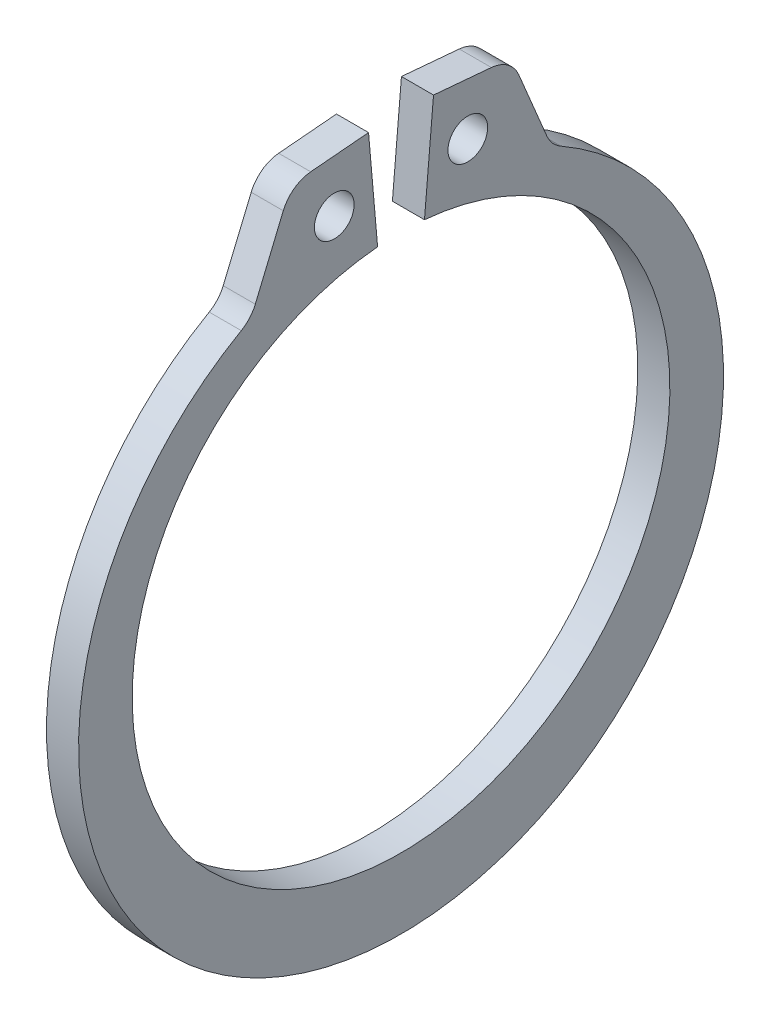
ISO-10303-21;
HEADER;
FILE_DESCRIPTION(('STEP AP214'),'2;1');
FILE_NAME('part.step','',(''),(''),'','','');
FILE_SCHEMA(('AUTOMOTIVE_DESIGN { 1 0 10303 214 1 1 1 1 }'));
ENDSEC;
DATA;
#1=APPLICATION_CONTEXT('core data for automotive mechanical design processes');
#2=APPLICATION_PROTOCOL_DEFINITION('international standard','automotive_design',2000,#1);
#3=PRODUCT_CONTEXT('',#1,'mechanical');
#4=PRODUCT('Part','Part','',(#3));
#5=PRODUCT_RELATED_PRODUCT_CATEGORY('part','',(#4));
#6=PRODUCT_DEFINITION_FORMATION('','',#4);
#7=PRODUCT_DEFINITION_CONTEXT('part definition',#1,'design');
#8=PRODUCT_DEFINITION('design','',#6,#7);
#9=PRODUCT_DEFINITION_SHAPE('','',#8);
#10=(LENGTH_UNIT() NAMED_UNIT(*) SI_UNIT(.MILLI.,.METRE.));
#11=(NAMED_UNIT(*) PLANE_ANGLE_UNIT() SI_UNIT($,.RADIAN.));
#12=(NAMED_UNIT(*) SI_UNIT($,.STERADIAN.) SOLID_ANGLE_UNIT());
#13=UNCERTAINTY_MEASURE_WITH_UNIT(LENGTH_MEASURE(1.E-05),#10,'distance_accuracy_value','');
#14=(GEOMETRIC_REPRESENTATION_CONTEXT(3) GLOBAL_UNCERTAINTY_ASSIGNED_CONTEXT((#13)) GLOBAL_UNIT_ASSIGNED_CONTEXT((#10,
#11,#12)) REPRESENTATION_CONTEXT('',''));
#15=CARTESIAN_POINT('',(0.,0.,0.));
#16=DIRECTION('',(0.,0.,1.));
#17=DIRECTION('',(1.,0.,0.));
#18=AXIS2_PLACEMENT_3D('',#15,#16,#17);
#19=CARTESIAN_POINT('',(0.5334,0.,0.));
#20=DIRECTION('',(1.,0.,0.));
#21=DIRECTION('',(0.,0.,-1.));
#22=AXIS2_PLACEMENT_3D('',#19,#20,#21);
#23=PLANE('',#22);
#24=CARTESIAN_POINT('',(0.5334,10.5145034900874,2.22024807554007));
#25=DIRECTION('',(1.,0.,0.));
#26=DIRECTION('',(0.,0.,-1.));
#27=AXIS2_PLACEMENT_3D('',#24,#25,#26);
#28=CIRCLE('',#27,0.6604);
#29=CARTESIAN_POINT('',(0.5334,10.5145034900874,1.55984807554007));
#30=VERTEX_POINT('',#29);
#31=EDGE_CURVE('E221',#30,#30,#28,.T.);
#32=ORIENTED_EDGE('',*,*,#31,.F.);
#33=EDGE_LOOP('',(#32));
#34=FACE_BOUND('',#33,.T.);
#35=DIRECTION('',(0.,-0.087155742747658,0.996194698091746));
#36=VECTOR('',#35,1.);
#37=CARTESIAN_POINT('',(0.5334,12.3480325217868,1.08031286250578));
#38=LINE('',#37,#36);
#39=CARTESIAN_POINT('',(0.5334,12.3480325217868,1.08031286250578));
#40=VERTEX_POINT('',#39);
#41=CARTESIAN_POINT('',(0.5334,12.1797719716871,3.0035397506368));
#42=VERTEX_POINT('',#41);
#43=EDGE_CURVE('E133',#40,#42,#38,.T.);
#44=ORIENTED_EDGE('',*,*,#43,.T.);
#45=CARTESIAN_POINT('',(0.5334,11.0917281224313,2.9083482484078));
#46=DIRECTION('',(1.,0.,0.));
#47=DIRECTION('',(0.,0.,-1.));
#48=AXIS2_PLACEMENT_3D('',#45,#46,#47);
#49=CIRCLE('',#48,1.0922);
#50=CARTESIAN_POINT('',(0.5334,11.5131216109069,3.9159832854477));
#51=VERTEX_POINT('',#50);
#52=EDGE_CURVE('E174',#42,#51,#49,.T.);
#53=ORIENTED_EDGE('',*,*,#52,.T.);
#54=DIRECTION('',(0.,-0.922573738362845,0.385820809810985));
#55=VECTOR('',#54,1.);
#56=CARTESIAN_POINT('',(0.5334,12.1222294234762,3.66125408632187));
#57=LINE('',#56,#55);
#58=CARTESIAN_POINT('',(0.5334,9.28769615286388,4.8466573515877));
#59=VERTEX_POINT('',#58);
#60=EDGE_CURVE('E213',#51,#59,#57,.T.);
#61=ORIENTED_EDGE('',*,*,#60,.T.);
#62=CARTESIAN_POINT('',(0.5334,9.70908964133944,5.8542923886276));
#63=DIRECTION('',(1.,0.,0.));
#64=DIRECTION('',(0.,0.,-1.));
#65=AXIS2_PLACEMENT_3D('',#62,#63,#64);
#66=CIRCLE('',#65,1.0922);
#67=CARTESIAN_POINT('',(0.5334,8.76037858528973,5.31313790779144));
#68=VERTEX_POINT('',#67);
#69=EDGE_CURVE('E181',#59,#68,#66,.F.);
#70=ORIENTED_EDGE('',*,*,#69,.T.);
#71=CARTESIAN_POINT('',(0.5334,-0.554212449141249,0.));
#72=DIRECTION('',(1.,0.,0.));
#73=DIRECTION('',(0.,0.,-1.));
#74=AXIS2_PLACEMENT_3D('',#71,#72,#73);
#75=CIRCLE('',#74,10.7233875508587);
#76=CARTESIAN_POINT('',(0.5334,8.76037858528973,-5.31313790779144));
#77=VERTEX_POINT('',#76);
#78=EDGE_CURVE('E206',#68,#77,#75,.T.);
#79=ORIENTED_EDGE('',*,*,#78,.T.);
#80=CARTESIAN_POINT('',(0.5334,9.70908964133944,-5.8542923886276));
#81=DIRECTION('',(1.,0.,0.));
#82=DIRECTION('',(0.,0.,-1.));
#83=AXIS2_PLACEMENT_3D('',#80,#81,#82);
#84=CIRCLE('',#83,1.0922);
#85=CARTESIAN_POINT('',(0.5334,9.28769615286388,-4.8466573515877));
#86=VERTEX_POINT('',#85);
#87=EDGE_CURVE('E11',#77,#86,#84,.F.);
#88=ORIENTED_EDGE('',*,*,#87,.T.);
#89=DIRECTION('',(0.,0.922573738362845,0.385820809810985));
#90=VECTOR('',#89,1.);
#91=CARTESIAN_POINT('',(0.5334,12.1222294234762,-3.66125408632187));
#92=LINE('',#91,#90);
#93=CARTESIAN_POINT('',(0.5334,11.5131216109069,-3.9159832854477));
#94=VERTEX_POINT('',#93);
#95=EDGE_CURVE('E205',#86,#94,#92,.T.);
#96=ORIENTED_EDGE('',*,*,#95,.T.);
#97=CARTESIAN_POINT('',(0.5334,11.0917281224313,-2.9083482484078));
#98=DIRECTION('',(1.,0.,0.));
#99=DIRECTION('',(0.,0.,-1.));
#100=AXIS2_PLACEMENT_3D('',#97,#98,#99);
#101=CIRCLE('',#100,1.0922);
#102=CARTESIAN_POINT('',(0.5334,12.1797719716871,-3.0035397506368));
#103=VERTEX_POINT('',#102);
#104=EDGE_CURVE('E49',#94,#103,#101,.T.);
#105=ORIENTED_EDGE('',*,*,#104,.T.);
#106=DIRECTION('',(0.,0.087155742747658,0.996194698091746));
#107=VECTOR('',#106,1.);
#108=CARTESIAN_POINT('',(0.5334,12.3480325217868,-1.08031286250578));
#109=LINE('',#108,#107);
#110=CARTESIAN_POINT('',(0.5334,12.3480325217868,-1.08031286250578));
#111=VERTEX_POINT('',#110);
#112=EDGE_CURVE('E210',#103,#111,#109,.T.);
#113=ORIENTED_EDGE('',*,*,#112,.T.);
#114=DIRECTION('',(0.,-0.996194698091746,0.0871557427476585));
#115=VECTOR('',#114,1.);
#116=CARTESIAN_POINT('',(0.5334,8.90677755669868,-0.779242064758265));
#117=LINE('',#116,#115);
#118=CARTESIAN_POINT('',(0.5334,8.90677755669868,-0.779242064758265));
#119=VERTEX_POINT('',#118);
#120=EDGE_CURVE('E139',#111,#119,#117,.T.);
#121=ORIENTED_EDGE('',*,*,#120,.T.);
#122=CARTESIAN_POINT('',(0.5334,0.,0.));
#123=DIRECTION('',(-1.,0.,0.));
#124=DIRECTION('',(0.,0.,-1.));
#125=AXIS2_PLACEMENT_3D('',#122,#123,#124);
#126=CIRCLE('',#125,8.9408);
#127=CARTESIAN_POINT('',(0.5334,8.90677755669868,0.779242064758265));
#128=VERTEX_POINT('',#127);
#129=EDGE_CURVE('E134',#119,#128,#126,.T.);
#130=ORIENTED_EDGE('',*,*,#129,.T.);
#131=DIRECTION('',(0.,0.996194698091746,0.0871557427476585));
#132=VECTOR('',#131,1.);
#133=CARTESIAN_POINT('',(0.5334,8.90677755669868,0.779242064758265));
#134=LINE('',#133,#132);
#135=EDGE_CURVE('E125',#128,#40,#134,.T.);
#136=ORIENTED_EDGE('',*,*,#135,.T.);
#137=EDGE_LOOP('',(#44,#53,#61,#70,#79,#88,#96,#105,#113,#121,#130,#136));
#138=FACE_BOUND('',#137,.T.);
#139=CARTESIAN_POINT('',(0.5334,10.5145034900874,-2.22024807554007));
#140=DIRECTION('',(1.,0.,0.));
#141=DIRECTION('',(0.,0.,-1.));
#142=AXIS2_PLACEMENT_3D('',#139,#140,#141);
#143=CIRCLE('',#142,0.6604);
#144=CARTESIAN_POINT('',(0.5334,10.5145034900874,-2.88064807554007));
#145=VERTEX_POINT('',#144);
#146=EDGE_CURVE('E247',#145,#145,#143,.T.);
#147=ORIENTED_EDGE('',*,*,#146,.F.);
#148=EDGE_LOOP('',(#147));
#149=FACE_BOUND('',#148,.T.);
#150=ADVANCED_FACE('F34',(#34,#138,#149),#23,.T.);
#151=CARTESIAN_POINT('',(-0.5334,0.,0.));
#152=DIRECTION('',(1.,0.,0.));
#153=DIRECTION('',(0.,0.,-1.));
#154=AXIS2_PLACEMENT_3D('',#151,#152,#153);
#155=PLANE('',#154);
#156=DIRECTION('',(0.,-0.922573738362845,0.385820809810985));
#157=VECTOR('',#156,1.);
#158=CARTESIAN_POINT('',(-0.5334,12.1222294234762,3.66125408632187));
#159=LINE('',#158,#157);
#160=CARTESIAN_POINT('',(-0.5334,11.5131216109069,3.9159832854477));
#161=VERTEX_POINT('',#160);
#162=CARTESIAN_POINT('',(-0.5334,9.28769615286388,4.8466573515877));
#163=VERTEX_POINT('',#162);
#164=EDGE_CURVE('E200',#161,#163,#159,.T.);
#165=ORIENTED_EDGE('',*,*,#164,.F.);
#166=CARTESIAN_POINT('',(-0.5334,11.0917281224313,2.9083482484078));
#167=DIRECTION('',(1.,0.,0.));
#168=DIRECTION('',(0.,0.,-1.));
#169=AXIS2_PLACEMENT_3D('',#166,#167,#168);
#170=CIRCLE('',#169,1.0922);
#171=CARTESIAN_POINT('',(-0.5334,12.1797719716871,3.0035397506368));
#172=VERTEX_POINT('',#171);
#173=EDGE_CURVE('E170',#161,#172,#170,.F.);
#174=ORIENTED_EDGE('',*,*,#173,.T.);
#175=DIRECTION('',(0.,-0.087155742747658,0.996194698091746));
#176=VECTOR('',#175,1.);
#177=CARTESIAN_POINT('',(-0.5334,12.3480325217868,1.08031286250578));
#178=LINE('',#177,#176);
#179=CARTESIAN_POINT('',(-0.5334,12.3480325217868,1.08031286250578));
#180=VERTEX_POINT('',#179);
#181=EDGE_CURVE('E223',#180,#172,#178,.T.);
#182=ORIENTED_EDGE('',*,*,#181,.F.);
#183=DIRECTION('',(0.,0.996194698091746,0.0871557427476585));
#184=VECTOR('',#183,1.);
#185=CARTESIAN_POINT('',(-0.5334,8.90677755669868,0.779242064758265));
#186=LINE('',#185,#184);
#187=CARTESIAN_POINT('',(-0.5334,8.90677755669868,0.779242064758265));
#188=VERTEX_POINT('',#187);
#189=EDGE_CURVE('E220',#188,#180,#186,.T.);
#190=ORIENTED_EDGE('',*,*,#189,.F.);
#191=CARTESIAN_POINT('',(-0.5334,0.,0.));
#192=DIRECTION('',(-1.,0.,0.));
#193=DIRECTION('',(0.,0.,-1.));
#194=AXIS2_PLACEMENT_3D('',#191,#192,#193);
#195=CIRCLE('',#194,8.9408);
#196=CARTESIAN_POINT('',(-0.5334,8.90677755669868,-0.779242064758265));
#197=VERTEX_POINT('',#196);
#198=EDGE_CURVE('E147',#197,#188,#195,.T.);
#199=ORIENTED_EDGE('',*,*,#198,.F.);
#200=DIRECTION('',(0.,-0.996194698091746,0.0871557427476585));
#201=VECTOR('',#200,1.);
#202=CARTESIAN_POINT('',(-0.5334,8.90677755669868,-0.779242064758265));
#203=LINE('',#202,#201);
#204=CARTESIAN_POINT('',(-0.5334,12.3480325217868,-1.08031286250578));
#205=VERTEX_POINT('',#204);
#206=EDGE_CURVE('E143',#205,#197,#203,.T.);
#207=ORIENTED_EDGE('',*,*,#206,.F.);
#208=DIRECTION('',(0.,0.087155742747658,0.996194698091746));
#209=VECTOR('',#208,1.);
#210=CARTESIAN_POINT('',(-0.5334,12.3480325217868,-1.08031286250578));
#211=LINE('',#210,#209);
#212=CARTESIAN_POINT('',(-0.5334,12.1797719716871,-3.0035397506368));
#213=VERTEX_POINT('',#212);
#214=EDGE_CURVE('E228',#213,#205,#211,.T.);
#215=ORIENTED_EDGE('',*,*,#214,.F.);
#216=CARTESIAN_POINT('',(-0.5334,11.0917281224313,-2.9083482484078));
#217=DIRECTION('',(1.,0.,0.));
#218=DIRECTION('',(0.,0.,-1.));
#219=AXIS2_PLACEMENT_3D('',#216,#217,#218);
#220=CIRCLE('',#219,1.0922);
#221=CARTESIAN_POINT('',(-0.5334,11.5131216109069,-3.9159832854477));
#222=VERTEX_POINT('',#221);
#223=EDGE_CURVE('E168',#213,#222,#220,.F.);
#224=ORIENTED_EDGE('',*,*,#223,.T.);
#225=DIRECTION('',(0.,0.922573738362845,0.385820809810985));
#226=VECTOR('',#225,1.);
#227=CARTESIAN_POINT('',(-0.5334,12.1222294234762,-3.66125408632187));
#228=LINE('',#227,#226);
#229=CARTESIAN_POINT('',(-0.5334,9.28769615286388,-4.8466573515877));
#230=VERTEX_POINT('',#229);
#231=EDGE_CURVE('E191',#230,#222,#228,.T.);
#232=ORIENTED_EDGE('',*,*,#231,.F.);
#233=CARTESIAN_POINT('',(-0.5334,9.70908964133944,-5.8542923886276));
#234=DIRECTION('',(1.,0.,0.));
#235=DIRECTION('',(0.,0.,-1.));
#236=AXIS2_PLACEMENT_3D('',#233,#234,#235);
#237=CIRCLE('',#236,1.0922);
#238=CARTESIAN_POINT('',(-0.5334,8.76037858528973,-5.31313790779144));
#239=VERTEX_POINT('',#238);
#240=EDGE_CURVE('E42',#230,#239,#237,.T.);
#241=ORIENTED_EDGE('',*,*,#240,.T.);
#242=CARTESIAN_POINT('',(-0.5334,-0.554212449141249,0.));
#243=DIRECTION('',(1.,0.,0.));
#244=DIRECTION('',(0.,0.,-1.));
#245=AXIS2_PLACEMENT_3D('',#242,#243,#244);
#246=CIRCLE('',#245,10.7233875508587);
#247=CARTESIAN_POINT('',(-0.5334,8.76037858528973,5.31313790779144));
#248=VERTEX_POINT('',#247);
#249=EDGE_CURVE('E189',#248,#239,#246,.T.);
#250=ORIENTED_EDGE('',*,*,#249,.F.);
#251=CARTESIAN_POINT('',(-0.5334,9.70908964133944,5.8542923886276));
#252=DIRECTION('',(1.,0.,0.));
#253=DIRECTION('',(0.,0.,-1.));
#254=AXIS2_PLACEMENT_3D('',#251,#252,#253);
#255=CIRCLE('',#254,1.0922);
#256=EDGE_CURVE('E179',#248,#163,#255,.T.);
#257=ORIENTED_EDGE('',*,*,#256,.T.);
#258=EDGE_LOOP('',(#165,#174,#182,#190,#199,#207,#215,#224,#232,#241,#250,#257));
#259=FACE_BOUND('',#258,.T.);
#260=CARTESIAN_POINT('',(-0.5334,10.5145034900874,2.22024807554007));
#261=DIRECTION('',(1.,0.,0.));
#262=DIRECTION('',(0.,0.,-1.));
#263=AXIS2_PLACEMENT_3D('',#260,#261,#262);
#264=CIRCLE('',#263,0.6604);
#265=CARTESIAN_POINT('',(-0.5334,10.5145034900874,1.55984807554007));
#266=VERTEX_POINT('',#265);
#267=EDGE_CURVE('E244',#266,#266,#264,.T.);
#268=ORIENTED_EDGE('',*,*,#267,.T.);
#269=EDGE_LOOP('',(#268));
#270=FACE_BOUND('',#269,.T.);
#271=CARTESIAN_POINT('',(-0.5334,10.5145034900874,-2.22024807554007));
#272=DIRECTION('',(1.,0.,0.));
#273=DIRECTION('',(0.,0.,-1.));
#274=AXIS2_PLACEMENT_3D('',#271,#272,#273);
#275=CIRCLE('',#274,0.6604);
#276=CARTESIAN_POINT('',(-0.5334,10.5145034900874,-2.88064807554007));
#277=VERTEX_POINT('',#276);
#278=EDGE_CURVE('E250',#277,#277,#275,.T.);
#279=ORIENTED_EDGE('',*,*,#278,.T.);
#280=EDGE_LOOP('',(#279));
#281=FACE_BOUND('',#280,.T.);
#282=ADVANCED_FACE('F187',(#259,#270,#281),#155,.F.);
#283=CARTESIAN_POINT('',(0.5334,0.,0.));
#284=DIRECTION('',(-1.,0.,0.));
#285=DIRECTION('',(0.,0.,1.));
#286=AXIS2_PLACEMENT_3D('',#283,#284,#285);
#287=CYLINDRICAL_SURFACE('',#286,8.9408);
#288=ORIENTED_EDGE('',*,*,#198,.T.);
#289=DIRECTION('',(-1.,0.,0.));
#290=VECTOR('',#289,1.);
#291=CARTESIAN_POINT('',(0.5334,8.90677755669868,0.779242064758265));
#292=LINE('',#291,#290);
#293=EDGE_CURVE('E129',#128,#188,#292,.T.);
#294=ORIENTED_EDGE('',*,*,#293,.F.);
#295=ORIENTED_EDGE('',*,*,#129,.F.);
#296=DIRECTION('',(-1.,0.,0.));
#297=VECTOR('',#296,1.);
#298=CARTESIAN_POINT('',(0.5334,8.90677755669868,-0.779242064758265));
#299=LINE('',#298,#297);
#300=EDGE_CURVE('E218',#119,#197,#299,.T.);
#301=ORIENTED_EDGE('',*,*,#300,.T.);
#302=EDGE_LOOP('',(#288,#294,#295,#301));
#303=FACE_BOUND('',#302,.T.);
#304=ADVANCED_FACE('F145',(#303),#287,.F.);
#305=CARTESIAN_POINT('',(0.5334,8.90677755669868,0.779242064758265));
#306=DIRECTION('',(0.,-0.0871557427476585,0.996194698091746));
#307=DIRECTION('',(0.,-0.996194698091746,-0.0871557427476585));
#308=AXIS2_PLACEMENT_3D('',#305,#306,#307);
#309=PLANE('',#308);
#310=ORIENTED_EDGE('',*,*,#189,.T.);
#311=DIRECTION('',(-1.,0.,0.));
#312=VECTOR('',#311,1.);
#313=CARTESIAN_POINT('',(0.5334,12.3480325217868,1.08031286250578));
#314=LINE('',#313,#312);
#315=EDGE_CURVE('E132',#40,#180,#314,.T.);
#316=ORIENTED_EDGE('',*,*,#315,.F.);
#317=ORIENTED_EDGE('',*,*,#135,.F.);
#318=ORIENTED_EDGE('',*,*,#293,.T.);
#319=EDGE_LOOP('',(#310,#316,#317,#318));
#320=FACE_BOUND('',#319,.T.);
#321=ADVANCED_FACE('F127',(#320),#309,.F.);
#322=CARTESIAN_POINT('',(0.5334,12.3480325217868,1.08031286250578));
#323=DIRECTION('',(0.,-0.996194698091745,-0.087155742747658));
#324=DIRECTION('',(0.,0.087155742747658,-0.996194698091746));
#325=AXIS2_PLACEMENT_3D('',#322,#323,#324);
#326=PLANE('',#325);
#327=ORIENTED_EDGE('',*,*,#181,.T.);
#328=DIRECTION('',(-1.,0.,0.));
#329=VECTOR('',#328,1.);
#330=CARTESIAN_POINT('',(0.5334,12.1797719716871,3.0035397506368));
#331=LINE('',#330,#329);
#332=EDGE_CURVE('E57',#172,#42,#331,.F.);
#333=ORIENTED_EDGE('',*,*,#332,.T.);
#334=ORIENTED_EDGE('',*,*,#43,.F.);
#335=ORIENTED_EDGE('',*,*,#315,.T.);
#336=EDGE_LOOP('',(#327,#333,#334,#335));
#337=FACE_BOUND('',#336,.T.);
#338=ADVANCED_FACE('F239',(#337),#326,.F.);
#339=CARTESIAN_POINT('',(0.5334,12.1222294234762,3.66125408632187));
#340=DIRECTION('',(0.,-0.385820809810985,-0.922573738362845));
#341=DIRECTION('',(0.,0.922573738362845,-0.385820809810985));
#342=AXIS2_PLACEMENT_3D('',#339,#340,#341);
#343=PLANE('',#342);
#344=ORIENTED_EDGE('',*,*,#164,.T.);
#345=DIRECTION('',(1.,0.,0.));
#346=VECTOR('',#345,1.);
#347=CARTESIAN_POINT('',(0.5334,9.28769615286388,4.8466573515877));
#348=LINE('',#347,#346);
#349=EDGE_CURVE('E161',#163,#59,#348,.T.);
#350=ORIENTED_EDGE('',*,*,#349,.T.);
#351=ORIENTED_EDGE('',*,*,#60,.F.);
#352=DIRECTION('',(-1.,0.,0.));
#353=VECTOR('',#352,1.);
#354=CARTESIAN_POINT('',(0.5334,11.5131216109069,3.9159832854477));
#355=LINE('',#354,#353);
#356=EDGE_CURVE('E158',#51,#161,#355,.T.);
#357=ORIENTED_EDGE('',*,*,#356,.T.);
#358=EDGE_LOOP('',(#344,#350,#351,#357));
#359=FACE_BOUND('',#358,.T.);
#360=ADVANCED_FACE('F279',(#359),#343,.F.);
#361=CARTESIAN_POINT('',(0.5334,-0.554212449141249,0.));
#362=DIRECTION('',(-1.,0.,0.));
#363=DIRECTION('',(0.,0.,1.));
#364=AXIS2_PLACEMENT_3D('',#361,#362,#363);
#365=CYLINDRICAL_SURFACE('',#364,10.7233875508587);
#366=ORIENTED_EDGE('',*,*,#78,.F.);
#367=DIRECTION('',(-1.,0.,0.));
#368=VECTOR('',#367,1.);
#369=CARTESIAN_POINT('',(0.5334,8.76037858528973,5.31313790779145));
#370=LINE('',#369,#368);
#371=EDGE_CURVE('E150',#68,#248,#370,.T.);
#372=ORIENTED_EDGE('',*,*,#371,.T.);
#373=ORIENTED_EDGE('',*,*,#249,.T.);
#374=DIRECTION('',(-1.,0.,0.));
#375=VECTOR('',#374,1.);
#376=CARTESIAN_POINT('',(0.5334,8.76037858528973,-5.31313790779145));
#377=LINE('',#376,#375);
#378=EDGE_CURVE('E148',#239,#77,#377,.F.);
#379=ORIENTED_EDGE('',*,*,#378,.T.);
#380=EDGE_LOOP('',(#366,#372,#373,#379));
#381=FACE_BOUND('',#380,.T.);
#382=ADVANCED_FACE('F197',(#381),#365,.T.);
#383=CARTESIAN_POINT('',(0.5334,12.1222294234762,-3.66125408632187));
#384=DIRECTION('',(0.,-0.385820809810985,0.922573738362845));
#385=DIRECTION('',(0.,-0.922573738362845,-0.385820809810985));
#386=AXIS2_PLACEMENT_3D('',#383,#384,#385);
#387=PLANE('',#386);
#388=ORIENTED_EDGE('',*,*,#95,.F.);
#389=DIRECTION('',(1.,0.,0.));
#390=VECTOR('',#389,1.);
#391=CARTESIAN_POINT('',(-0.5334,9.28769615286388,-4.8466573515877));
#392=LINE('',#391,#390);
#393=EDGE_CURVE('E165',#86,#230,#392,.F.);
#394=ORIENTED_EDGE('',*,*,#393,.T.);
#395=ORIENTED_EDGE('',*,*,#231,.T.);
#396=DIRECTION('',(-1.,0.,0.));
#397=VECTOR('',#396,1.);
#398=CARTESIAN_POINT('',(0.5334,11.5131216109069,-3.9159832854477));
#399=LINE('',#398,#397);
#400=EDGE_CURVE('E163',#222,#94,#399,.F.);
#401=ORIENTED_EDGE('',*,*,#400,.T.);
#402=EDGE_LOOP('',(#388,#394,#395,#401));
#403=FACE_BOUND('',#402,.T.);
#404=ADVANCED_FACE('F208',(#403),#387,.F.);
#405=CARTESIAN_POINT('',(0.5334,12.3480325217868,-1.08031286250578));
#406=DIRECTION('',(0.,-0.996194698091745,0.087155742747658));
#407=DIRECTION('',(0.,-0.087155742747658,-0.996194698091746));
#408=AXIS2_PLACEMENT_3D('',#405,#406,#407);
#409=PLANE('',#408);
#410=ORIENTED_EDGE('',*,*,#112,.F.);
#411=DIRECTION('',(-1.,0.,0.));
#412=VECTOR('',#411,1.);
#413=CARTESIAN_POINT('',(0.5334,12.1797719716871,-3.0035397506368));
#414=LINE('',#413,#412);
#415=EDGE_CURVE('E176',#103,#213,#414,.T.);
#416=ORIENTED_EDGE('',*,*,#415,.T.);
#417=ORIENTED_EDGE('',*,*,#214,.T.);
#418=DIRECTION('',(-1.,0.,0.));
#419=VECTOR('',#418,1.);
#420=CARTESIAN_POINT('',(0.5334,12.3480325217868,-1.08031286250578));
#421=LINE('',#420,#419);
#422=EDGE_CURVE('E152',#111,#205,#421,.T.);
#423=ORIENTED_EDGE('',*,*,#422,.F.);
#424=EDGE_LOOP('',(#410,#416,#417,#423));
#425=FACE_BOUND('',#424,.T.);
#426=ADVANCED_FACE('F272',(#425),#409,.F.);
#427=CARTESIAN_POINT('',(0.5334,8.90677755669868,-0.779242064758265));
#428=DIRECTION('',(0.,-0.0871557427476585,-0.996194698091746));
#429=DIRECTION('',(0.,0.996194698091746,-0.0871557427476585));
#430=AXIS2_PLACEMENT_3D('',#427,#428,#429);
#431=PLANE('',#430);
#432=ORIENTED_EDGE('',*,*,#206,.T.);
#433=ORIENTED_EDGE('',*,*,#300,.F.);
#434=ORIENTED_EDGE('',*,*,#120,.F.);
#435=ORIENTED_EDGE('',*,*,#422,.T.);
#436=EDGE_LOOP('',(#432,#433,#434,#435));
#437=FACE_BOUND('',#436,.T.);
#438=ADVANCED_FACE('F235',(#437),#431,.F.);
#439=CARTESIAN_POINT('',(0.5334,10.5145034900874,2.22024807554007));
#440=DIRECTION('',(-1.,0.,0.));
#441=DIRECTION('',(0.,0.,1.));
#442=AXIS2_PLACEMENT_3D('',#439,#440,#441);
#443=CYLINDRICAL_SURFACE('',#442,0.6604);
#444=ORIENTED_EDGE('',*,*,#31,.T.);
#445=EDGE_LOOP('',(#444));
#446=FACE_BOUND('',#445,.T.);
#447=ORIENTED_EDGE('',*,*,#267,.F.);
#448=EDGE_LOOP('',(#447));
#449=FACE_BOUND('',#448,.T.);
#450=ADVANCED_FACE('F267',(#446,#449),#443,.F.);
#451=CARTESIAN_POINT('',(0.5334,10.5145034900874,-2.22024807554007));
#452=DIRECTION('',(-1.,0.,0.));
#453=DIRECTION('',(0.,0.,1.));
#454=AXIS2_PLACEMENT_3D('',#451,#452,#453);
#455=CYLINDRICAL_SURFACE('',#454,0.6604);
#456=ORIENTED_EDGE('',*,*,#146,.T.);
#457=EDGE_LOOP('',(#456));
#458=FACE_BOUND('',#457,.T.);
#459=ORIENTED_EDGE('',*,*,#278,.F.);
#460=EDGE_LOOP('',(#459));
#461=FACE_BOUND('',#460,.T.);
#462=ADVANCED_FACE('F256',(#458,#461),#455,.F.);
#463=CARTESIAN_POINT('',(0.5334,9.70908964133944,5.8542923886276));
#464=DIRECTION('',(-1.,0.,0.));
#465=DIRECTION('',(0.,0.,1.));
#466=AXIS2_PLACEMENT_3D('',#463,#464,#465);
#467=CYLINDRICAL_SURFACE('',#466,1.0922);
#468=ORIENTED_EDGE('',*,*,#69,.F.);
#469=ORIENTED_EDGE('',*,*,#349,.F.);
#470=ORIENTED_EDGE('',*,*,#256,.F.);
#471=ORIENTED_EDGE('',*,*,#371,.F.);
#472=EDGE_LOOP('',(#468,#469,#470,#471));
#473=FACE_BOUND('',#472,.T.);
#474=ADVANCED_FACE('F289',(#473),#467,.F.);
#475=CARTESIAN_POINT('',(0.5334,9.70908964133944,-5.8542923886276));
#476=DIRECTION('',(-1.,0.,0.));
#477=DIRECTION('',(0.,0.,1.));
#478=AXIS2_PLACEMENT_3D('',#475,#476,#477);
#479=CYLINDRICAL_SURFACE('',#478,1.0922);
#480=ORIENTED_EDGE('',*,*,#87,.F.);
#481=ORIENTED_EDGE('',*,*,#378,.F.);
#482=ORIENTED_EDGE('',*,*,#240,.F.);
#483=ORIENTED_EDGE('',*,*,#393,.F.);
#484=EDGE_LOOP('',(#480,#481,#482,#483));
#485=FACE_BOUND('',#484,.T.);
#486=ADVANCED_FACE('F203',(#485),#479,.F.);
#487=CARTESIAN_POINT('',(0.5334,11.0917281224313,2.9083482484078));
#488=DIRECTION('',(-1.,0.,0.));
#489=DIRECTION('',(0.,0.,1.));
#490=AXIS2_PLACEMENT_3D('',#487,#488,#489);
#491=CYLINDRICAL_SURFACE('',#490,1.0922);
#492=ORIENTED_EDGE('',*,*,#52,.F.);
#493=ORIENTED_EDGE('',*,*,#332,.F.);
#494=ORIENTED_EDGE('',*,*,#173,.F.);
#495=ORIENTED_EDGE('',*,*,#356,.F.);
#496=EDGE_LOOP('',(#492,#493,#494,#495));
#497=FACE_BOUND('',#496,.T.);
#498=ADVANCED_FACE('F294',(#497),#491,.T.);
#499=CARTESIAN_POINT('',(0.5334,11.0917281224313,-2.9083482484078));
#500=DIRECTION('',(-1.,0.,0.));
#501=DIRECTION('',(0.,0.,1.));
#502=AXIS2_PLACEMENT_3D('',#499,#500,#501);
#503=CYLINDRICAL_SURFACE('',#502,1.0922);
#504=ORIENTED_EDGE('',*,*,#104,.F.);
#505=ORIENTED_EDGE('',*,*,#400,.F.);
#506=ORIENTED_EDGE('',*,*,#223,.F.);
#507=ORIENTED_EDGE('',*,*,#415,.F.);
#508=EDGE_LOOP('',(#504,#505,#506,#507));
#509=FACE_BOUND('',#508,.T.);
#510=ADVANCED_FACE('F36',(#509),#503,.T.);
#511=CLOSED_SHELL('',(#150,#282,#304,#321,#338,#360,#382,#404,#426,#438,#450,#462,#474,#486,
#498,#510));
#512=MANIFOLD_SOLID_BREP('B2',#511);
#513=ADVANCED_BREP_SHAPE_REPRESENTATION('',(#18,#512),#14);
#514=SHAPE_DEFINITION_REPRESENTATION(#9,#513);
ENDSEC;
END-ISO-10303-21;
